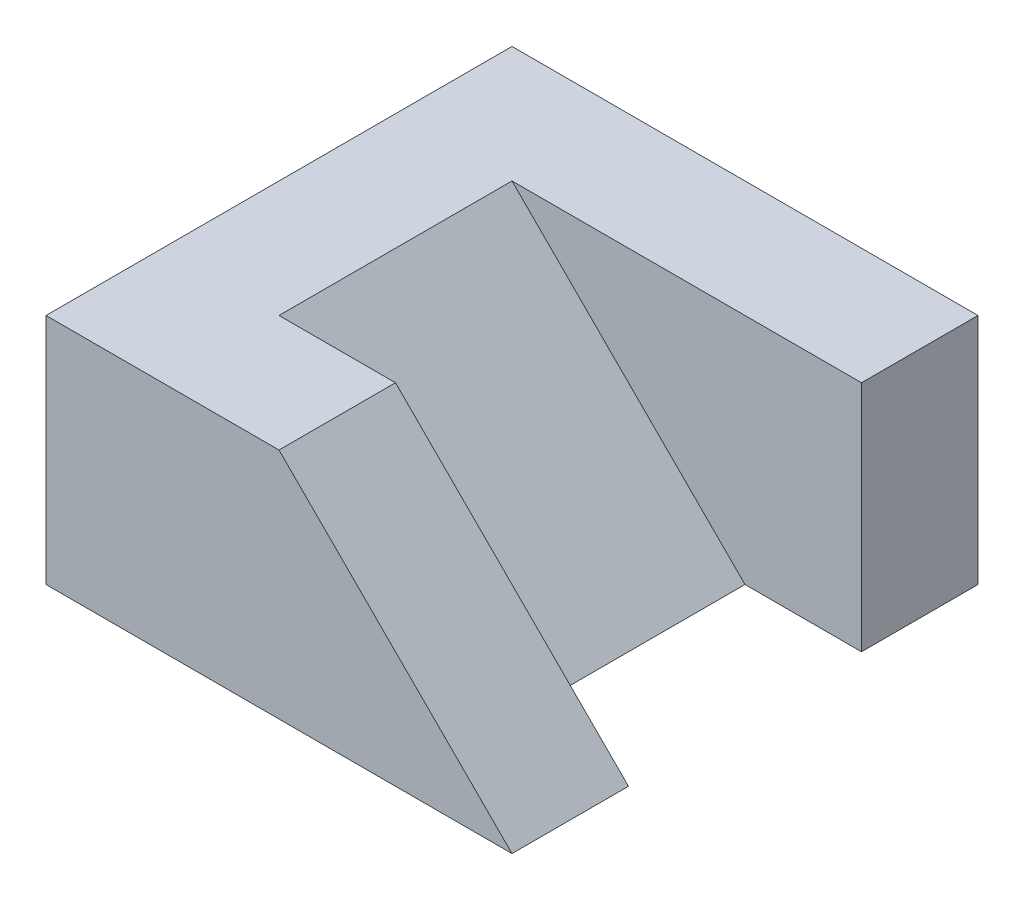
ISO-10303-21;
HEADER;
FILE_DESCRIPTION(('STEP AP214'),'2;1');
FILE_NAME('part.step','',(''),(''),'','','');
FILE_SCHEMA(('AUTOMOTIVE_DESIGN { 1 0 10303 214 1 1 1 1 }'));
ENDSEC;
DATA;
#1=APPLICATION_CONTEXT('core data for automotive mechanical design processes');
#2=APPLICATION_PROTOCOL_DEFINITION('international standard','automotive_design',2000,#1);
#3=PRODUCT_CONTEXT('',#1,'mechanical');
#4=PRODUCT('Part','Part','',(#3));
#5=PRODUCT_RELATED_PRODUCT_CATEGORY('part','',(#4));
#6=PRODUCT_DEFINITION_FORMATION('','',#4);
#7=PRODUCT_DEFINITION_CONTEXT('part definition',#1,'design');
#8=PRODUCT_DEFINITION('design','',#6,#7);
#9=PRODUCT_DEFINITION_SHAPE('','',#8);
#10=(LENGTH_UNIT() NAMED_UNIT(*) SI_UNIT(.MILLI.,.METRE.));
#11=(NAMED_UNIT(*) PLANE_ANGLE_UNIT() SI_UNIT($,.RADIAN.));
#12=(NAMED_UNIT(*) SI_UNIT($,.STERADIAN.) SOLID_ANGLE_UNIT());
#13=UNCERTAINTY_MEASURE_WITH_UNIT(LENGTH_MEASURE(1.E-05),#10,'distance_accuracy_value','');
#14=(GEOMETRIC_REPRESENTATION_CONTEXT(3) GLOBAL_UNCERTAINTY_ASSIGNED_CONTEXT((#13)) GLOBAL_UNIT_ASSIGNED_CONTEXT((#10,
#11,#12)) REPRESENTATION_CONTEXT('',''));
#15=CARTESIAN_POINT('',(0.,0.,0.));
#16=DIRECTION('',(0.,0.,1.));
#17=DIRECTION('',(1.,0.,0.));
#18=AXIS2_PLACEMENT_3D('',#15,#16,#17);
#19=CARTESIAN_POINT('',(0.,0.,5.));
#20=DIRECTION('',(0.,0.,-1.));
#21=DIRECTION('',(-1.,0.,0.));
#22=AXIS2_PLACEMENT_3D('',#19,#20,#21);
#23=PLANE('',#22);
#24=DIRECTION('',(-0.707106781186548,0.707106781186547,0.));
#25=VECTOR('',#24,1.);
#26=CARTESIAN_POINT('',(5.,10.,5.));
#27=LINE('',#26,#25);
#28=CARTESIAN_POINT('',(15.,0.,5.));
#29=VERTEX_POINT('',#28);
#30=CARTESIAN_POINT('',(5.,10.,5.));
#31=VERTEX_POINT('',#30);
#32=EDGE_CURVE('E144',#29,#31,#27,.T.);
#33=ORIENTED_EDGE('',*,*,#32,.F.);
#34=DIRECTION('',(1.,0.,0.));
#35=VECTOR('',#34,1.);
#36=CARTESIAN_POINT('',(0.,0.,5.));
#37=LINE('',#36,#35);
#38=CARTESIAN_POINT('',(20.,0.,5.));
#39=VERTEX_POINT('',#38);
#40=EDGE_CURVE('E91',#29,#39,#37,.T.);
#41=ORIENTED_EDGE('',*,*,#40,.T.);
#42=DIRECTION('',(0.,1.,0.));
#43=VECTOR('',#42,1.);
#44=CARTESIAN_POINT('',(20.,0.,5.));
#45=LINE('',#44,#43);
#46=CARTESIAN_POINT('',(20.,10.,5.));
#47=VERTEX_POINT('',#46);
#48=EDGE_CURVE('E50',#39,#47,#45,.T.);
#49=ORIENTED_EDGE('',*,*,#48,.T.);
#50=DIRECTION('',(-1.,0.,0.));
#51=VECTOR('',#50,1.);
#52=CARTESIAN_POINT('',(0.,10.,5.));
#53=LINE('',#52,#51);
#54=EDGE_CURVE('E84',#47,#31,#53,.T.);
#55=ORIENTED_EDGE('',*,*,#54,.T.);
#56=EDGE_LOOP('',(#33,#41,#49,#55));
#57=FACE_BOUND('',#56,.T.);
#58=ADVANCED_FACE('F33',(#57),#23,.F.);
#59=CARTESIAN_POINT('',(0.,0.,15.));
#60=DIRECTION('',(0.,0.,-1.));
#61=DIRECTION('',(-1.,0.,0.));
#62=AXIS2_PLACEMENT_3D('',#59,#60,#61);
#63=PLANE('',#62);
#64=DIRECTION('',(1.,0.,0.));
#65=VECTOR('',#64,1.);
#66=CARTESIAN_POINT('',(0.,0.,15.));
#67=LINE('',#66,#65);
#68=CARTESIAN_POINT('',(15.,0.,15.));
#69=VERTEX_POINT('',#68);
#70=CARTESIAN_POINT('',(20.,0.,15.));
#71=VERTEX_POINT('',#70);
#72=EDGE_CURVE('E152',#69,#71,#67,.T.);
#73=ORIENTED_EDGE('',*,*,#72,.F.);
#74=DIRECTION('',(-0.707106781186548,0.707106781186547,0.));
#75=VECTOR('',#74,1.);
#76=CARTESIAN_POINT('',(5.,10.,15.));
#77=LINE('',#76,#75);
#78=CARTESIAN_POINT('',(5.,10.,15.));
#79=VERTEX_POINT('',#78);
#80=EDGE_CURVE('E142',#69,#79,#77,.T.);
#81=ORIENTED_EDGE('',*,*,#80,.T.);
#82=DIRECTION('',(-1.,0.,0.));
#83=VECTOR('',#82,1.);
#84=CARTESIAN_POINT('',(0.,10.,15.));
#85=LINE('',#84,#83);
#86=CARTESIAN_POINT('',(10.,10.,15.));
#87=VERTEX_POINT('',#86);
#88=EDGE_CURVE('E151',#87,#79,#85,.T.);
#89=ORIENTED_EDGE('',*,*,#88,.F.);
#90=DIRECTION('',(-0.707106781186548,0.707106781186548,0.));
#91=VECTOR('',#90,1.);
#92=CARTESIAN_POINT('',(10.,10.,15.));
#93=LINE('',#92,#91);
#94=EDGE_CURVE('E158',#71,#87,#93,.T.);
#95=ORIENTED_EDGE('',*,*,#94,.F.);
#96=EDGE_LOOP('',(#73,#81,#89,#95));
#97=FACE_BOUND('',#96,.T.);
#98=ADVANCED_FACE('F149',(#97),#63,.T.);
#99=CARTESIAN_POINT('',(0.,0.,5.));
#100=DIRECTION('',(1.,0.,0.));
#101=DIRECTION('',(0.,0.,-1.));
#102=AXIS2_PLACEMENT_3D('',#99,#100,#101);
#103=PLANE('',#102);
#104=DIRECTION('',(0.,-1.,0.));
#105=VECTOR('',#104,1.);
#106=CARTESIAN_POINT('',(0.,0.,0.));
#107=LINE('',#106,#105);
#108=CARTESIAN_POINT('',(0.,10.,0.));
#109=VERTEX_POINT('',#108);
#110=CARTESIAN_POINT('',(0.,0.,0.));
#111=VERTEX_POINT('',#110);
#112=EDGE_CURVE('E76',#109,#111,#107,.T.);
#113=ORIENTED_EDGE('',*,*,#112,.T.);
#114=DIRECTION('',(0.,0.,-1.));
#115=VECTOR('',#114,1.);
#116=CARTESIAN_POINT('',(0.,0.,5.));
#117=LINE('',#116,#115);
#118=CARTESIAN_POINT('',(0.,0.,20.));
#119=VERTEX_POINT('',#118);
#120=EDGE_CURVE('E11',#119,#111,#117,.T.);
#121=ORIENTED_EDGE('',*,*,#120,.F.);
#122=DIRECTION('',(0.,-1.,0.));
#123=VECTOR('',#122,1.);
#124=CARTESIAN_POINT('',(0.,0.,20.));
#125=LINE('',#124,#123);
#126=CARTESIAN_POINT('',(0.,10.,20.));
#127=VERTEX_POINT('',#126);
#128=EDGE_CURVE('E79',#127,#119,#125,.T.);
#129=ORIENTED_EDGE('',*,*,#128,.F.);
#130=DIRECTION('',(0.,0.,-1.));
#131=VECTOR('',#130,1.);
#132=CARTESIAN_POINT('',(0.,10.,5.));
#133=LINE('',#132,#131);
#134=EDGE_CURVE('E72',#127,#109,#133,.T.);
#135=ORIENTED_EDGE('',*,*,#134,.T.);
#136=EDGE_LOOP('',(#113,#121,#129,#135));
#137=FACE_BOUND('',#136,.T.);
#138=ADVANCED_FACE('F35',(#137),#103,.F.);
#139=CARTESIAN_POINT('',(0.,0.,5.));
#140=DIRECTION('',(0.,1.,0.));
#141=DIRECTION('',(0.,0.,1.));
#142=AXIS2_PLACEMENT_3D('',#139,#140,#141);
#143=PLANE('',#142);
#144=ORIENTED_EDGE('',*,*,#120,.T.);
#145=DIRECTION('',(1.,0.,0.));
#146=VECTOR('',#145,1.);
#147=CARTESIAN_POINT('',(0.,0.,0.));
#148=LINE('',#147,#146);
#149=CARTESIAN_POINT('',(20.,0.,0.));
#150=VERTEX_POINT('',#149);
#151=EDGE_CURVE('E95',#111,#150,#148,.T.);
#152=ORIENTED_EDGE('',*,*,#151,.T.);
#153=DIRECTION('',(0.,0.,-1.));
#154=VECTOR('',#153,1.);
#155=CARTESIAN_POINT('',(20.,0.,5.));
#156=LINE('',#155,#154);
#157=EDGE_CURVE('E42',#39,#150,#156,.T.);
#158=ORIENTED_EDGE('',*,*,#157,.F.);
#159=ORIENTED_EDGE('',*,*,#40,.F.);
#160=DIRECTION('',(0.,0.,-1.));
#161=VECTOR('',#160,1.);
#162=CARTESIAN_POINT('',(15.,0.,15.));
#163=LINE('',#162,#161);
#164=EDGE_CURVE('E153',#69,#29,#163,.T.);
#165=ORIENTED_EDGE('',*,*,#164,.F.);
#166=ORIENTED_EDGE('',*,*,#72,.T.);
#167=DIRECTION('',(0.,0.,-1.));
#168=VECTOR('',#167,1.);
#169=CARTESIAN_POINT('',(20.,0.,20.));
#170=LINE('',#169,#168);
#171=CARTESIAN_POINT('',(20.,0.,20.));
#172=VERTEX_POINT('',#171);
#173=EDGE_CURVE('E100',#172,#71,#170,.T.);
#174=ORIENTED_EDGE('',*,*,#173,.F.);
#175=DIRECTION('',(1.,0.,0.));
#176=VECTOR('',#175,1.);
#177=CARTESIAN_POINT('',(0.,0.,20.));
#178=LINE('',#177,#176);
#179=EDGE_CURVE('E117',#119,#172,#178,.T.);
#180=ORIENTED_EDGE('',*,*,#179,.F.);
#181=EDGE_LOOP('',(#144,#152,#158,#159,#165,#166,#174,#180));
#182=FACE_BOUND('',#181,.T.);
#183=ADVANCED_FACE('F110',(#182),#143,.F.);
#184=CARTESIAN_POINT('',(20.,0.,5.));
#185=DIRECTION('',(-1.,0.,0.));
#186=DIRECTION('',(0.,0.,1.));
#187=AXIS2_PLACEMENT_3D('',#184,#185,#186);
#188=PLANE('',#187);
#189=DIRECTION('',(0.,1.,0.));
#190=VECTOR('',#189,1.);
#191=CARTESIAN_POINT('',(20.,0.,0.));
#192=LINE('',#191,#190);
#193=CARTESIAN_POINT('',(20.,10.,0.));
#194=VERTEX_POINT('',#193);
#195=EDGE_CURVE('E65',#150,#194,#192,.T.);
#196=ORIENTED_EDGE('',*,*,#195,.T.);
#197=DIRECTION('',(0.,0.,-1.));
#198=VECTOR('',#197,1.);
#199=CARTESIAN_POINT('',(20.,10.,5.));
#200=LINE('',#199,#198);
#201=EDGE_CURVE('E83',#47,#194,#200,.T.);
#202=ORIENTED_EDGE('',*,*,#201,.F.);
#203=ORIENTED_EDGE('',*,*,#48,.F.);
#204=ORIENTED_EDGE('',*,*,#157,.T.);
#205=EDGE_LOOP('',(#196,#202,#203,#204));
#206=FACE_BOUND('',#205,.T.);
#207=ADVANCED_FACE('F107',(#206),#188,.F.);
#208=CARTESIAN_POINT('',(0.,10.,5.));
#209=DIRECTION('',(0.,-1.,0.));
#210=DIRECTION('',(0.,0.,-1.));
#211=AXIS2_PLACEMENT_3D('',#208,#209,#210);
#212=PLANE('',#211);
#213=DIRECTION('',(-1.,0.,0.));
#214=VECTOR('',#213,1.);
#215=CARTESIAN_POINT('',(0.,10.,0.));
#216=LINE('',#215,#214);
#217=EDGE_CURVE('E87',#194,#109,#216,.T.);
#218=ORIENTED_EDGE('',*,*,#217,.T.);
#219=ORIENTED_EDGE('',*,*,#134,.F.);
#220=DIRECTION('',(-1.,0.,0.));
#221=VECTOR('',#220,1.);
#222=CARTESIAN_POINT('',(0.,10.,20.));
#223=LINE('',#222,#221);
#224=CARTESIAN_POINT('',(10.,10.,20.));
#225=VERTEX_POINT('',#224);
#226=EDGE_CURVE('E165',#225,#127,#223,.T.);
#227=ORIENTED_EDGE('',*,*,#226,.F.);
#228=DIRECTION('',(0.,0.,-1.));
#229=VECTOR('',#228,1.);
#230=CARTESIAN_POINT('',(10.,10.,20.));
#231=LINE('',#230,#229);
#232=EDGE_CURVE('E157',#225,#87,#231,.T.);
#233=ORIENTED_EDGE('',*,*,#232,.T.);
#234=ORIENTED_EDGE('',*,*,#88,.T.);
#235=DIRECTION('',(0.,0.,-1.));
#236=VECTOR('',#235,1.);
#237=CARTESIAN_POINT('',(5.,10.,15.));
#238=LINE('',#237,#236);
#239=EDGE_CURVE('E96',#79,#31,#238,.T.);
#240=ORIENTED_EDGE('',*,*,#239,.T.);
#241=ORIENTED_EDGE('',*,*,#54,.F.);
#242=ORIENTED_EDGE('',*,*,#201,.T.);
#243=EDGE_LOOP('',(#218,#219,#227,#233,#234,#240,#241,#242));
#244=FACE_BOUND('',#243,.T.);
#245=ADVANCED_FACE('F88',(#244),#212,.F.);
#246=CARTESIAN_POINT('',(0.,0.,0.));
#247=DIRECTION('',(0.,0.,-1.));
#248=DIRECTION('',(-1.,0.,0.));
#249=AXIS2_PLACEMENT_3D('',#246,#247,#248);
#250=PLANE('',#249);
#251=ORIENTED_EDGE('',*,*,#112,.F.);
#252=ORIENTED_EDGE('',*,*,#217,.F.);
#253=ORIENTED_EDGE('',*,*,#195,.F.);
#254=ORIENTED_EDGE('',*,*,#151,.F.);
#255=EDGE_LOOP('',(#251,#252,#253,#254));
#256=FACE_BOUND('',#255,.T.);
#257=ADVANCED_FACE('F94',(#256),#250,.T.);
#258=CARTESIAN_POINT('',(10.,10.,20.));
#259=DIRECTION('',(-0.707106781186548,-0.707106781186548,0.));
#260=DIRECTION('',(0.707106781186548,-0.707106781186548,0.));
#261=AXIS2_PLACEMENT_3D('',#258,#259,#260);
#262=PLANE('',#261);
#263=ORIENTED_EDGE('',*,*,#94,.T.);
#264=ORIENTED_EDGE('',*,*,#232,.F.);
#265=DIRECTION('',(-0.707106781186548,0.707106781186548,0.));
#266=VECTOR('',#265,1.);
#267=CARTESIAN_POINT('',(10.,10.,20.));
#268=LINE('',#267,#266);
#269=EDGE_CURVE('E173',#172,#225,#268,.T.);
#270=ORIENTED_EDGE('',*,*,#269,.F.);
#271=ORIENTED_EDGE('',*,*,#173,.T.);
#272=EDGE_LOOP('',(#263,#264,#270,#271));
#273=FACE_BOUND('',#272,.T.);
#274=ADVANCED_FACE('F179',(#273),#262,.F.);
#275=CARTESIAN_POINT('',(0.,0.,20.));
#276=DIRECTION('',(0.,0.,-1.));
#277=DIRECTION('',(-1.,0.,0.));
#278=AXIS2_PLACEMENT_3D('',#275,#276,#277);
#279=PLANE('',#278);
#280=ORIENTED_EDGE('',*,*,#128,.T.);
#281=ORIENTED_EDGE('',*,*,#179,.T.);
#282=ORIENTED_EDGE('',*,*,#269,.T.);
#283=ORIENTED_EDGE('',*,*,#226,.T.);
#284=EDGE_LOOP('',(#280,#281,#282,#283));
#285=FACE_BOUND('',#284,.T.);
#286=ADVANCED_FACE('F176',(#285),#279,.F.);
#287=CARTESIAN_POINT('',(5.,10.,15.));
#288=DIRECTION('',(-0.707106781186547,-0.707106781186548,0.));
#289=DIRECTION('',(0.707106781186548,-0.707106781186547,0.));
#290=AXIS2_PLACEMENT_3D('',#287,#288,#289);
#291=PLANE('',#290);
#292=ORIENTED_EDGE('',*,*,#32,.T.);
#293=ORIENTED_EDGE('',*,*,#239,.F.);
#294=ORIENTED_EDGE('',*,*,#80,.F.);
#295=ORIENTED_EDGE('',*,*,#164,.T.);
#296=EDGE_LOOP('',(#292,#293,#294,#295));
#297=FACE_BOUND('',#296,.T.);
#298=ADVANCED_FACE('F140',(#297),#291,.F.);
#299=CLOSED_SHELL('',(#58,#98,#138,#183,#207,#245,#257,#274,#286,#298));
#300=MANIFOLD_SOLID_BREP('B2',#299);
#301=ADVANCED_BREP_SHAPE_REPRESENTATION('',(#18,#300),#14);
#302=SHAPE_DEFINITION_REPRESENTATION(#9,#301);
ENDSEC;
END-ISO-10303-21;
